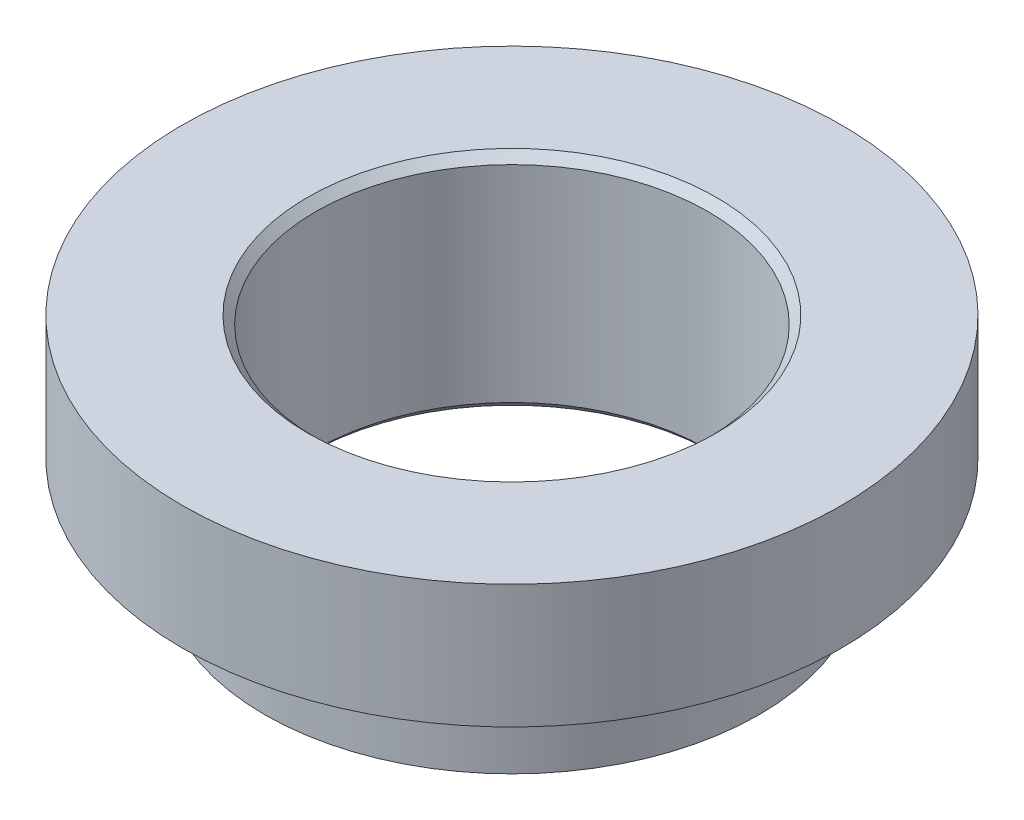
ISO-10303-21;
HEADER;
FILE_DESCRIPTION(('STEP AP214'),'2;1');
FILE_NAME('part.step','',(''),(''),'','','');
FILE_SCHEMA(('AUTOMOTIVE_DESIGN { 1 0 10303 214 1 1 1 1 }'));
ENDSEC;
DATA;
#1=APPLICATION_CONTEXT('core data for automotive mechanical design processes');
#2=APPLICATION_PROTOCOL_DEFINITION('international standard','automotive_design',2000,#1);
#3=PRODUCT_CONTEXT('',#1,'mechanical');
#4=PRODUCT('Part','Part','',(#3));
#5=PRODUCT_RELATED_PRODUCT_CATEGORY('part','',(#4));
#6=PRODUCT_DEFINITION_FORMATION('','',#4);
#7=PRODUCT_DEFINITION_CONTEXT('part definition',#1,'design');
#8=PRODUCT_DEFINITION('design','',#6,#7);
#9=PRODUCT_DEFINITION_SHAPE('','',#8);
#10=(LENGTH_UNIT() NAMED_UNIT(*) SI_UNIT(.MILLI.,.METRE.));
#11=(NAMED_UNIT(*) PLANE_ANGLE_UNIT() SI_UNIT($,.RADIAN.));
#12=(NAMED_UNIT(*) SI_UNIT($,.STERADIAN.) SOLID_ANGLE_UNIT());
#13=UNCERTAINTY_MEASURE_WITH_UNIT(LENGTH_MEASURE(1.E-05),#10,'distance_accuracy_value','');
#14=(GEOMETRIC_REPRESENTATION_CONTEXT(3) GLOBAL_UNCERTAINTY_ASSIGNED_CONTEXT((#13)) GLOBAL_UNIT_ASSIGNED_CONTEXT((#10,
#11,#12)) REPRESENTATION_CONTEXT('',''));
#15=CARTESIAN_POINT('',(0.,0.,0.));
#16=DIRECTION('',(0.,0.,1.));
#17=DIRECTION('',(1.,0.,0.));
#18=AXIS2_PLACEMENT_3D('',#15,#16,#17);
#19=CARTESIAN_POINT('',(0.,0.,0.));
#20=DIRECTION('',(0.,1.,0.));
#21=DIRECTION('',(0.,0.,1.));
#22=AXIS2_PLACEMENT_3D('',#19,#20,#21);
#23=CYLINDRICAL_SURFACE('',#22,20.);
#24=CARTESIAN_POINT('',(0.,-7.5,0.));
#25=DIRECTION('',(0.,1.,0.));
#26=DIRECTION('',(0.,0.,1.));
#27=AXIS2_PLACEMENT_3D('',#24,#25,#26);
#28=CIRCLE('',#27,20.);
#29=CARTESIAN_POINT('',(0.,-7.5,20.));
#30=VERTEX_POINT('',#29);
#31=EDGE_CURVE('E10',#30,#30,#28,.T.);
#32=ORIENTED_EDGE('',*,*,#31,.T.);
#33=EDGE_LOOP('',(#32));
#34=FACE_BOUND('',#33,.T.);
#35=CARTESIAN_POINT('',(0.,0.,0.));
#36=DIRECTION('',(0.,1.,0.));
#37=DIRECTION('',(0.,0.,1.));
#38=AXIS2_PLACEMENT_3D('',#35,#36,#37);
#39=CIRCLE('',#38,20.);
#40=CARTESIAN_POINT('',(0.,0.,20.));
#41=VERTEX_POINT('',#40);
#42=EDGE_CURVE('E58',#41,#41,#39,.T.);
#43=ORIENTED_EDGE('',*,*,#42,.F.);
#44=EDGE_LOOP('',(#43));
#45=FACE_BOUND('',#44,.T.);
#46=ADVANCED_FACE('F30',(#34,#45),#23,.T.);
#47=CARTESIAN_POINT('',(-20.,-7.5,0.));
#48=DIRECTION('',(0.,-1.,0.));
#49=DIRECTION('',(0.,0.,-1.));
#50=AXIS2_PLACEMENT_3D('',#47,#48,#49);
#51=PLANE('',#50);
#52=CARTESIAN_POINT('',(0.,-7.5,0.));
#53=DIRECTION('',(0.,1.,0.));
#54=DIRECTION('',(0.,0.,1.));
#55=AXIS2_PLACEMENT_3D('',#52,#53,#54);
#56=CIRCLE('',#55,15.);
#57=CARTESIAN_POINT('',(0.,-7.5,15.));
#58=VERTEX_POINT('',#57);
#59=EDGE_CURVE('E36',#58,#58,#56,.T.);
#60=ORIENTED_EDGE('',*,*,#59,.T.);
#61=EDGE_LOOP('',(#60));
#62=FACE_BOUND('',#61,.T.);
#63=ORIENTED_EDGE('',*,*,#31,.F.);
#64=EDGE_LOOP('',(#63));
#65=FACE_BOUND('',#64,.T.);
#66=ADVANCED_FACE('F66',(#62,#65),#51,.T.);
#67=CARTESIAN_POINT('',(0.,0.,0.));
#68=DIRECTION('',(0.,1.,0.));
#69=DIRECTION('',(0.,0.,1.));
#70=AXIS2_PLACEMENT_3D('',#67,#68,#69);
#71=CYLINDRICAL_SURFACE('',#70,15.);
#72=CARTESIAN_POINT('',(0.,-13.5,0.));
#73=DIRECTION('',(0.,1.,0.));
#74=DIRECTION('',(0.,0.,1.));
#75=AXIS2_PLACEMENT_3D('',#72,#73,#74);
#76=CIRCLE('',#75,15.);
#77=CARTESIAN_POINT('',(0.,-13.5,15.));
#78=VERTEX_POINT('',#77);
#79=EDGE_CURVE('E40',#78,#78,#76,.T.);
#80=ORIENTED_EDGE('',*,*,#79,.T.);
#81=EDGE_LOOP('',(#80));
#82=FACE_BOUND('',#81,.T.);
#83=ORIENTED_EDGE('',*,*,#59,.F.);
#84=EDGE_LOOP('',(#83));
#85=FACE_BOUND('',#84,.T.);
#86=ADVANCED_FACE('F70',(#82,#85),#71,.T.);
#87=CARTESIAN_POINT('',(-15.,-13.5,0.));
#88=DIRECTION('',(0.,-1.,0.));
#89=DIRECTION('',(0.,0.,-1.));
#90=AXIS2_PLACEMENT_3D('',#87,#88,#89);
#91=PLANE('',#90);
#92=CARTESIAN_POINT('',(0.,-13.5,0.));
#93=DIRECTION('',(0.,1.,0.));
#94=DIRECTION('',(0.,0.,1.));
#95=AXIS2_PLACEMENT_3D('',#92,#93,#94);
#96=CIRCLE('',#95,12.4);
#97=CARTESIAN_POINT('',(0.,-13.5,12.4));
#98=VERTEX_POINT('',#97);
#99=EDGE_CURVE('E44',#98,#98,#96,.T.);
#100=ORIENTED_EDGE('',*,*,#99,.T.);
#101=EDGE_LOOP('',(#100));
#102=FACE_BOUND('',#101,.T.);
#103=ORIENTED_EDGE('',*,*,#79,.F.);
#104=EDGE_LOOP('',(#103));
#105=FACE_BOUND('',#104,.T.);
#106=ADVANCED_FACE('F74',(#102,#105),#91,.T.);
#107=CARTESIAN_POINT('',(0.,-13.5,0.));
#108=DIRECTION('',(0.,-1.,0.));
#109=DIRECTION('',(0.,0.,-1.));
#110=AXIS2_PLACEMENT_3D('',#107,#108,#109);
#111=CONICAL_SURFACE('',#110,12.4,0.785398163397448);
#112=CARTESIAN_POINT('',(0.,-13.,0.));
#113=DIRECTION('',(0.,1.,0.));
#114=DIRECTION('',(0.,0.,1.));
#115=AXIS2_PLACEMENT_3D('',#112,#113,#114);
#116=CIRCLE('',#115,11.9);
#117=CARTESIAN_POINT('',(0.,-13.,11.9));
#118=VERTEX_POINT('',#117);
#119=EDGE_CURVE('E49',#118,#118,#116,.T.);
#120=ORIENTED_EDGE('',*,*,#119,.T.);
#121=EDGE_LOOP('',(#120));
#122=FACE_BOUND('',#121,.T.);
#123=ORIENTED_EDGE('',*,*,#99,.F.);
#124=EDGE_LOOP('',(#123));
#125=FACE_BOUND('',#124,.T.);
#126=ADVANCED_FACE('F81',(#122,#125),#111,.F.);
#127=CARTESIAN_POINT('',(0.,0.,0.));
#128=DIRECTION('',(0.,1.,0.));
#129=DIRECTION('',(0.,0.,1.));
#130=AXIS2_PLACEMENT_3D('',#127,#128,#129);
#131=CYLINDRICAL_SURFACE('',#130,11.9);
#132=CARTESIAN_POINT('',(0.,-0.500000000000001,0.));
#133=DIRECTION('',(0.,1.,0.));
#134=DIRECTION('',(0.,0.,1.));
#135=AXIS2_PLACEMENT_3D('',#132,#133,#134);
#136=CIRCLE('',#135,11.9);
#137=CARTESIAN_POINT('',(0.,-0.500000000000001,11.9));
#138=VERTEX_POINT('',#137);
#139=EDGE_CURVE('E52',#138,#138,#136,.T.);
#140=ORIENTED_EDGE('',*,*,#139,.T.);
#141=EDGE_LOOP('',(#140));
#142=FACE_BOUND('',#141,.T.);
#143=ORIENTED_EDGE('',*,*,#119,.F.);
#144=EDGE_LOOP('',(#143));
#145=FACE_BOUND('',#144,.T.);
#146=ADVANCED_FACE('F85',(#142,#145),#131,.F.);
#147=CARTESIAN_POINT('',(0.,-0.500000000000001,0.));
#148=DIRECTION('',(0.,1.,0.));
#149=DIRECTION('',(0.,0.,1.));
#150=AXIS2_PLACEMENT_3D('',#147,#148,#149);
#151=CONICAL_SURFACE('',#150,11.9,0.785398163397448);
#152=CARTESIAN_POINT('',(0.,0.,0.));
#153=DIRECTION('',(0.,1.,0.));
#154=DIRECTION('',(0.,0.,1.));
#155=AXIS2_PLACEMENT_3D('',#152,#153,#154);
#156=CIRCLE('',#155,12.4);
#157=CARTESIAN_POINT('',(0.,0.,12.4));
#158=VERTEX_POINT('',#157);
#159=EDGE_CURVE('E55',#158,#158,#156,.T.);
#160=ORIENTED_EDGE('',*,*,#159,.T.);
#161=EDGE_LOOP('',(#160));
#162=FACE_BOUND('',#161,.T.);
#163=ORIENTED_EDGE('',*,*,#139,.F.);
#164=EDGE_LOOP('',(#163));
#165=FACE_BOUND('',#164,.T.);
#166=ADVANCED_FACE('F89',(#162,#165),#151,.F.);
#167=CARTESIAN_POINT('',(-12.4,0.,0.));
#168=DIRECTION('',(0.,1.,0.));
#169=DIRECTION('',(0.,0.,1.));
#170=AXIS2_PLACEMENT_3D('',#167,#168,#169);
#171=PLANE('',#170);
#172=ORIENTED_EDGE('',*,*,#42,.T.);
#173=EDGE_LOOP('',(#172));
#174=FACE_BOUND('',#173,.T.);
#175=ORIENTED_EDGE('',*,*,#159,.F.);
#176=EDGE_LOOP('',(#175));
#177=FACE_BOUND('',#176,.T.);
#178=ADVANCED_FACE('F62',(#174,#177),#171,.T.);
#179=CLOSED_SHELL('',(#46,#66,#86,#106,#126,#146,#166,#178));
#180=MANIFOLD_SOLID_BREP('B2',#179);
#181=ADVANCED_BREP_SHAPE_REPRESENTATION('',(#18,#180),#14);
#182=SHAPE_DEFINITION_REPRESENTATION(#9,#181);
ENDSEC;
END-ISO-10303-21;
